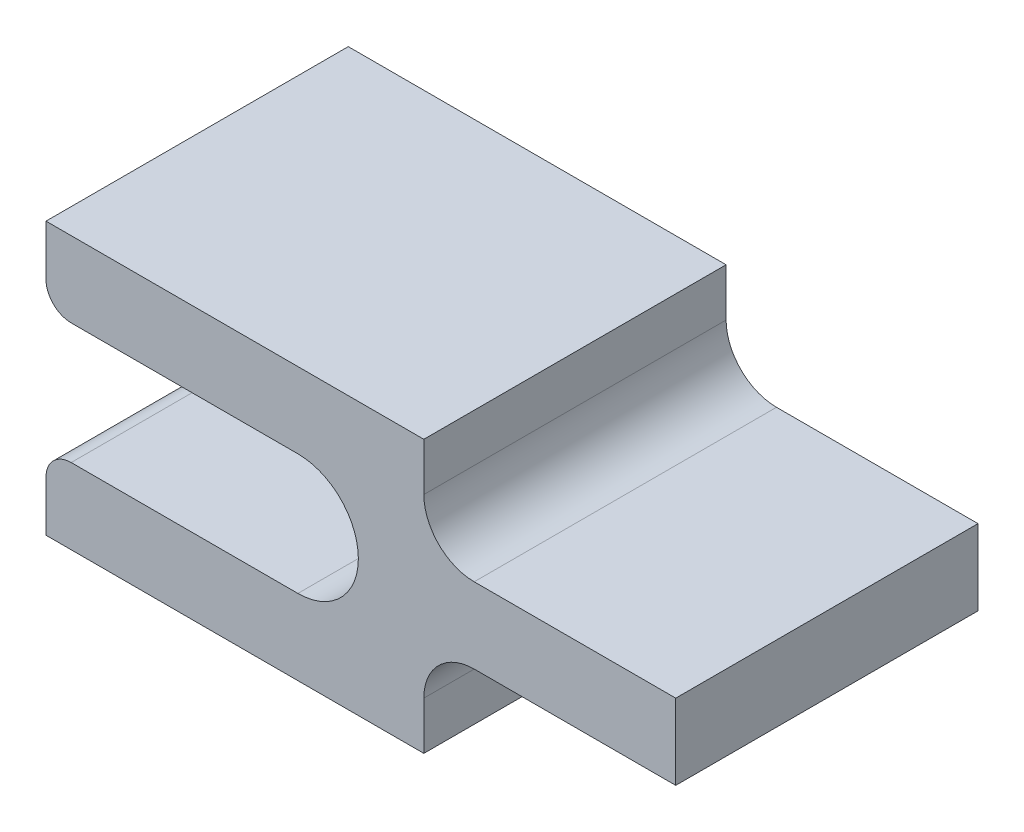
ISO-10303-21;
HEADER;
FILE_DESCRIPTION(('STEP AP214'),'2;1');
FILE_NAME('part.step','',(''),(''),'','','');
FILE_SCHEMA(('AUTOMOTIVE_DESIGN { 1 0 10303 214 1 1 1 1 }'));
ENDSEC;
DATA;
#1=APPLICATION_CONTEXT('core data for automotive mechanical design processes');
#2=APPLICATION_PROTOCOL_DEFINITION('international standard','automotive_design',2000,#1);
#3=PRODUCT_CONTEXT('',#1,'mechanical');
#4=PRODUCT('Part','Part','',(#3));
#5=PRODUCT_RELATED_PRODUCT_CATEGORY('part','',(#4));
#6=PRODUCT_DEFINITION_FORMATION('','',#4);
#7=PRODUCT_DEFINITION_CONTEXT('part definition',#1,'design');
#8=PRODUCT_DEFINITION('design','',#6,#7);
#9=PRODUCT_DEFINITION_SHAPE('','',#8);
#10=(LENGTH_UNIT() NAMED_UNIT(*) SI_UNIT(.MILLI.,.METRE.));
#11=(NAMED_UNIT(*) PLANE_ANGLE_UNIT() SI_UNIT($,.RADIAN.));
#12=(NAMED_UNIT(*) SI_UNIT($,.STERADIAN.) SOLID_ANGLE_UNIT());
#13=UNCERTAINTY_MEASURE_WITH_UNIT(LENGTH_MEASURE(1.E-05),#10,'distance_accuracy_value','');
#14=(GEOMETRIC_REPRESENTATION_CONTEXT(3) GLOBAL_UNCERTAINTY_ASSIGNED_CONTEXT((#13)) GLOBAL_UNIT_ASSIGNED_CONTEXT((#10,
#11,#12)) REPRESENTATION_CONTEXT('',''));
#15=CARTESIAN_POINT('',(0.,0.,0.));
#16=DIRECTION('',(0.,0.,1.));
#17=DIRECTION('',(1.,0.,0.));
#18=AXIS2_PLACEMENT_3D('',#15,#16,#17);
#19=CARTESIAN_POINT('',(5.,0.,-2.));
#20=DIRECTION('',(-1.,0.,0.));
#21=DIRECTION('',(0.,0.,1.));
#22=AXIS2_PLACEMENT_3D('',#19,#20,#21);
#23=PLANE('',#22);
#24=DIRECTION('',(0.,-1.,0.));
#25=VECTOR('',#24,1.);
#26=CARTESIAN_POINT('',(5.,0.,10.));
#27=LINE('',#26,#25);
#28=CARTESIAN_POINT('',(5.,5.4,10.));
#29=VERTEX_POINT('',#28);
#30=CARTESIAN_POINT('',(5.,3.5,10.));
#31=VERTEX_POINT('',#30);
#32=EDGE_CURVE('E269',#29,#31,#27,.T.);
#33=ORIENTED_EDGE('',*,*,#32,.T.);
#34=DIRECTION('',(0.,0.,1.));
#35=VECTOR('',#34,1.);
#36=CARTESIAN_POINT('',(5.,3.5,-2.));
#37=LINE('',#36,#35);
#38=CARTESIAN_POINT('',(5.,3.5,-2.));
#39=VERTEX_POINT('',#38);
#40=EDGE_CURVE('E56',#31,#39,#37,.F.);
#41=ORIENTED_EDGE('',*,*,#40,.T.);
#42=DIRECTION('',(0.,-1.,0.));
#43=VECTOR('',#42,1.);
#44=CARTESIAN_POINT('',(5.,0.,-2.));
#45=LINE('',#44,#43);
#46=CARTESIAN_POINT('',(5.,5.4,-2.));
#47=VERTEX_POINT('',#46);
#48=EDGE_CURVE('E274',#47,#39,#45,.T.);
#49=ORIENTED_EDGE('',*,*,#48,.F.);
#50=DIRECTION('',(0.,0.,1.));
#51=VECTOR('',#50,1.);
#52=CARTESIAN_POINT('',(5.,5.4,-2.));
#53=LINE('',#52,#51);
#54=EDGE_CURVE('E383',#47,#29,#53,.T.);
#55=ORIENTED_EDGE('',*,*,#54,.T.);
#56=EDGE_LOOP('',(#33,#41,#49,#55));
#57=FACE_BOUND('',#56,.T.);
#58=ADVANCED_FACE('F35',(#57),#23,.F.);
#59=CARTESIAN_POINT('',(0.,2.4,-2.));
#60=DIRECTION('',(0.,1.,0.));
#61=DIRECTION('',(0.,0.,1.));
#62=AXIS2_PLACEMENT_3D('',#59,#60,#61);
#63=PLANE('',#62);
#64=DIRECTION('',(-1.,0.,0.));
#65=VECTOR('',#64,1.);
#66=CARTESIAN_POINT('',(0.,2.4,10.));
#67=LINE('',#66,#65);
#68=CARTESIAN_POINT('',(0.,2.4,10.));
#69=VERTEX_POINT('',#68);
#70=CARTESIAN_POINT('',(-9.,2.4,10.));
#71=VERTEX_POINT('',#70);
#72=EDGE_CURVE('E245',#69,#71,#67,.T.);
#73=ORIENTED_EDGE('',*,*,#72,.T.);
#74=DIRECTION('',(0.,0.,1.));
#75=VECTOR('',#74,1.);
#76=CARTESIAN_POINT('',(-9.,2.4,-2.));
#77=LINE('',#76,#75);
#78=CARTESIAN_POINT('',(-9.,2.4,0.));
#79=VERTEX_POINT('',#78);
#80=EDGE_CURVE('E361',#71,#79,#77,.F.);
#81=ORIENTED_EDGE('',*,*,#80,.T.);
#82=DIRECTION('',(1.,0.,0.));
#83=VECTOR('',#82,1.);
#84=CARTESIAN_POINT('',(0.,2.4,0.));
#85=LINE('',#84,#83);
#86=CARTESIAN_POINT('',(0.,2.4,0.));
#87=VERTEX_POINT('',#86);
#88=EDGE_CURVE('E243',#79,#87,#85,.T.);
#89=ORIENTED_EDGE('',*,*,#88,.T.);
#90=DIRECTION('',(0.,0.,1.));
#91=VECTOR('',#90,1.);
#92=CARTESIAN_POINT('',(0.,2.4,-2.));
#93=LINE('',#92,#91);
#94=EDGE_CURVE('E374',#87,#69,#93,.T.);
#95=ORIENTED_EDGE('',*,*,#94,.T.);
#96=EDGE_LOOP('',(#73,#81,#89,#95));
#97=FACE_BOUND('',#96,.T.);
#98=ADVANCED_FACE('F395',(#97),#63,.F.);
#99=CARTESIAN_POINT('',(-10.,0.,-2.));
#100=DIRECTION('',(1.,0.,0.));
#101=DIRECTION('',(0.,0.,-1.));
#102=AXIS2_PLACEMENT_3D('',#99,#100,#101);
#103=PLANE('',#102);
#104=DIRECTION('',(0.,1.,0.));
#105=VECTOR('',#104,1.);
#106=CARTESIAN_POINT('',(-10.,0.,-2.));
#107=LINE('',#106,#105);
#108=CARTESIAN_POINT('',(-10.,2.6,-2.));
#109=VERTEX_POINT('',#108);
#110=CARTESIAN_POINT('',(-10.,5.4,-2.));
#111=VERTEX_POINT('',#110);
#112=EDGE_CURVE('E377',#109,#111,#107,.T.);
#113=ORIENTED_EDGE('',*,*,#112,.F.);
#114=DIRECTION('',(0.,0.,1.));
#115=VECTOR('',#114,1.);
#116=CARTESIAN_POINT('',(-10.,2.6,-2.));
#117=LINE('',#116,#115);
#118=CARTESIAN_POINT('',(-10.,2.6,0.));
#119=VERTEX_POINT('',#118);
#120=EDGE_CURVE('E347',#109,#119,#117,.T.);
#121=ORIENTED_EDGE('',*,*,#120,.T.);
#122=DIRECTION('',(0.,1.,0.));
#123=VECTOR('',#122,1.);
#124=CARTESIAN_POINT('',(-10.,0.,0.));
#125=LINE('',#124,#123);
#126=CARTESIAN_POINT('',(-10.,3.4,0.));
#127=VERTEX_POINT('',#126);
#128=EDGE_CURVE('E227',#119,#127,#125,.T.);
#129=ORIENTED_EDGE('',*,*,#128,.T.);
#130=DIRECTION('',(0.,0.,1.));
#131=VECTOR('',#130,1.);
#132=CARTESIAN_POINT('',(-10.,3.4,-2.));
#133=LINE('',#132,#131);
#134=CARTESIAN_POINT('',(-10.,3.4,10.));
#135=VERTEX_POINT('',#134);
#136=EDGE_CURVE('E367',#127,#135,#133,.T.);
#137=ORIENTED_EDGE('',*,*,#136,.T.);
#138=DIRECTION('',(0.,1.,0.));
#139=VECTOR('',#138,1.);
#140=CARTESIAN_POINT('',(-10.,0.,10.));
#141=LINE('',#140,#139);
#142=CARTESIAN_POINT('',(-10.,5.4,10.));
#143=VERTEX_POINT('',#142);
#144=EDGE_CURVE('E615',#135,#143,#141,.T.);
#145=ORIENTED_EDGE('',*,*,#144,.T.);
#146=DIRECTION('',(0.,0.,1.));
#147=VECTOR('',#146,1.);
#148=CARTESIAN_POINT('',(-10.,5.4,-2.));
#149=LINE('',#148,#147);
#150=EDGE_CURVE('E373',#111,#143,#149,.T.);
#151=ORIENTED_EDGE('',*,*,#150,.F.);
#152=EDGE_LOOP('',(#113,#121,#129,#137,#145,#151));
#153=FACE_BOUND('',#152,.T.);
#154=ADVANCED_FACE('F400',(#153),#103,.F.);
#155=CARTESIAN_POINT('',(0.,5.4,-2.));
#156=DIRECTION('',(0.,-1.,0.));
#157=DIRECTION('',(0.,0.,-1.));
#158=AXIS2_PLACEMENT_3D('',#155,#156,#157);
#159=PLANE('',#158);
#160=DIRECTION('',(1.,0.,0.));
#161=VECTOR('',#160,1.);
#162=CARTESIAN_POINT('',(0.,5.4,10.));
#163=LINE('',#162,#161);
#164=EDGE_CURVE('E262',#143,#29,#163,.T.);
#165=ORIENTED_EDGE('',*,*,#164,.T.);
#166=ORIENTED_EDGE('',*,*,#54,.F.);
#167=DIRECTION('',(1.,0.,0.));
#168=VECTOR('',#167,1.);
#169=CARTESIAN_POINT('',(0.,5.4,-2.));
#170=LINE('',#169,#168);
#171=EDGE_CURVE('E276',#111,#47,#170,.T.);
#172=ORIENTED_EDGE('',*,*,#171,.F.);
#173=ORIENTED_EDGE('',*,*,#150,.T.);
#174=EDGE_LOOP('',(#165,#166,#172,#173));
#175=FACE_BOUND('',#174,.T.);
#176=ADVANCED_FACE('F392',(#175),#159,.F.);
#177=CARTESIAN_POINT('',(5.,-3.5,-2.));
#178=VERTEX_POINT('',#177);
#179=CARTESIAN_POINT('',(5.,-5.4,-2.));
#180=VERTEX_POINT('',#179);
#181=EDGE_CURVE('E277',#178,#180,#45,.T.);
#182=ORIENTED_EDGE('',*,*,#181,.F.);
#183=DIRECTION('',(0.,0.,1.));
#184=VECTOR('',#183,1.);
#185=CARTESIAN_POINT('',(5.,-3.5,10.));
#186=LINE('',#185,#184);
#187=CARTESIAN_POINT('',(5.,-3.5,10.));
#188=VERTEX_POINT('',#187);
#189=EDGE_CURVE('E308',#178,#188,#186,.T.);
#190=ORIENTED_EDGE('',*,*,#189,.T.);
#191=CARTESIAN_POINT('',(5.,-5.4,10.));
#192=VERTEX_POINT('',#191);
#193=EDGE_CURVE('E259',#188,#192,#27,.T.);
#194=ORIENTED_EDGE('',*,*,#193,.T.);
#195=DIRECTION('',(0.,0.,1.));
#196=VECTOR('',#195,1.);
#197=CARTESIAN_POINT('',(5.,-5.4,-2.));
#198=LINE('',#197,#196);
#199=EDGE_CURVE('E323',#180,#192,#198,.T.);
#200=ORIENTED_EDGE('',*,*,#199,.F.);
#201=EDGE_LOOP('',(#182,#190,#194,#200));
#202=FACE_BOUND('',#201,.T.);
#203=ADVANCED_FACE('F321',(#202),#23,.F.);
#204=CARTESIAN_POINT('',(0.,-5.4,-2.));
#205=DIRECTION('',(0.,1.,0.));
#206=DIRECTION('',(0.,0.,1.));
#207=AXIS2_PLACEMENT_3D('',#204,#205,#206);
#208=PLANE('',#207);
#209=DIRECTION('',(-1.,0.,0.));
#210=VECTOR('',#209,1.);
#211=CARTESIAN_POINT('',(0.,-5.4,10.));
#212=LINE('',#211,#210);
#213=CARTESIAN_POINT('',(-10.,-5.4,10.));
#214=VERTEX_POINT('',#213);
#215=EDGE_CURVE('E256',#192,#214,#212,.T.);
#216=ORIENTED_EDGE('',*,*,#215,.T.);
#217=DIRECTION('',(0.,0.,1.));
#218=VECTOR('',#217,1.);
#219=CARTESIAN_POINT('',(-10.,-5.4,-2.));
#220=LINE('',#219,#218);
#221=CARTESIAN_POINT('',(-10.,-5.4,-2.));
#222=VERTEX_POINT('',#221);
#223=EDGE_CURVE('E380',#222,#214,#220,.T.);
#224=ORIENTED_EDGE('',*,*,#223,.F.);
#225=DIRECTION('',(-1.,0.,0.));
#226=VECTOR('',#225,1.);
#227=CARTESIAN_POINT('',(0.,-5.4,-2.));
#228=LINE('',#227,#226);
#229=EDGE_CURVE('E282',#180,#222,#228,.T.);
#230=ORIENTED_EDGE('',*,*,#229,.F.);
#231=ORIENTED_EDGE('',*,*,#199,.T.);
#232=EDGE_LOOP('',(#216,#224,#230,#231));
#233=FACE_BOUND('',#232,.T.);
#234=ADVANCED_FACE('F406',(#233),#208,.F.);
#235=CARTESIAN_POINT('',(-10.,0.,-2.));
#236=DIRECTION('',(1.,0.,0.));
#237=DIRECTION('',(0.,0.,-1.));
#238=AXIS2_PLACEMENT_3D('',#235,#236,#237);
#239=PLANE('',#238);
#240=DIRECTION('',(0.,-1.,0.));
#241=VECTOR('',#240,1.);
#242=CARTESIAN_POINT('',(-10.,0.,0.));
#243=LINE('',#242,#241);
#244=CARTESIAN_POINT('',(-10.,-2.6,0.));
#245=VERTEX_POINT('',#244);
#246=CARTESIAN_POINT('',(-10.,-3.4,0.));
#247=VERTEX_POINT('',#246);
#248=EDGE_CURVE('E213',#245,#247,#243,.T.);
#249=ORIENTED_EDGE('',*,*,#248,.F.);
#250=DIRECTION('',(0.,0.,1.));
#251=VECTOR('',#250,1.);
#252=CARTESIAN_POINT('',(-10.,-2.6,-2.));
#253=LINE('',#252,#251);
#254=CARTESIAN_POINT('',(-10.,-2.6,-2.));
#255=VERTEX_POINT('',#254);
#256=EDGE_CURVE('E272',#245,#255,#253,.F.);
#257=ORIENTED_EDGE('',*,*,#256,.T.);
#258=DIRECTION('',(0.,1.,0.));
#259=VECTOR('',#258,1.);
#260=CARTESIAN_POINT('',(-10.,0.,-2.));
#261=LINE('',#260,#259);
#262=EDGE_CURVE('E603',#222,#255,#261,.T.);
#263=ORIENTED_EDGE('',*,*,#262,.F.);
#264=ORIENTED_EDGE('',*,*,#223,.T.);
#265=DIRECTION('',(0.,1.,0.));
#266=VECTOR('',#265,1.);
#267=CARTESIAN_POINT('',(-10.,0.,10.));
#268=LINE('',#267,#266);
#269=CARTESIAN_POINT('',(-10.,-3.4,10.));
#270=VERTEX_POINT('',#269);
#271=EDGE_CURVE('E253',#214,#270,#268,.T.);
#272=ORIENTED_EDGE('',*,*,#271,.T.);
#273=DIRECTION('',(0.,0.,1.));
#274=VECTOR('',#273,1.);
#275=CARTESIAN_POINT('',(-10.,-3.4,-2.));
#276=LINE('',#275,#274);
#277=EDGE_CURVE('E355',#270,#247,#276,.F.);
#278=ORIENTED_EDGE('',*,*,#277,.T.);
#279=EDGE_LOOP('',(#249,#257,#263,#264,#272,#278));
#280=FACE_BOUND('',#279,.T.);
#281=ADVANCED_FACE('F411',(#280),#239,.F.);
#282=CARTESIAN_POINT('',(0.,-2.4,-2.));
#283=DIRECTION('',(0.,-1.,0.));
#284=DIRECTION('',(0.,0.,-1.));
#285=AXIS2_PLACEMENT_3D('',#282,#283,#284);
#286=PLANE('',#285);
#287=DIRECTION('',(-1.,0.,0.));
#288=VECTOR('',#287,1.);
#289=CARTESIAN_POINT('',(0.,-2.4,0.));
#290=LINE('',#289,#288);
#291=CARTESIAN_POINT('',(0.,-2.4,0.));
#292=VERTEX_POINT('',#291);
#293=CARTESIAN_POINT('',(-9.,-2.4,0.));
#294=VERTEX_POINT('',#293);
#295=EDGE_CURVE('E239',#292,#294,#290,.T.);
#296=ORIENTED_EDGE('',*,*,#295,.T.);
#297=DIRECTION('',(0.,0.,1.));
#298=VECTOR('',#297,1.);
#299=CARTESIAN_POINT('',(-9.,-2.4,-2.));
#300=LINE('',#299,#298);
#301=CARTESIAN_POINT('',(-9.,-2.4,10.));
#302=VERTEX_POINT('',#301);
#303=EDGE_CURVE('E358',#294,#302,#300,.T.);
#304=ORIENTED_EDGE('',*,*,#303,.T.);
#305=DIRECTION('',(1.,0.,0.));
#306=VECTOR('',#305,1.);
#307=CARTESIAN_POINT('',(0.,-2.4,10.));
#308=LINE('',#307,#306);
#309=CARTESIAN_POINT('',(0.,-2.4,10.));
#310=VERTEX_POINT('',#309);
#311=EDGE_CURVE('E251',#302,#310,#308,.T.);
#312=ORIENTED_EDGE('',*,*,#311,.T.);
#313=DIRECTION('',(0.,0.,1.));
#314=VECTOR('',#313,1.);
#315=CARTESIAN_POINT('',(0.,-2.4,-2.));
#316=LINE('',#315,#314);
#317=EDGE_CURVE('E376',#292,#310,#316,.T.);
#318=ORIENTED_EDGE('',*,*,#317,.F.);
#319=EDGE_LOOP('',(#296,#304,#312,#318));
#320=FACE_BOUND('',#319,.T.);
#321=ADVANCED_FACE('F592',(#320),#286,.F.);
#322=CARTESIAN_POINT('',(0.,0.,-2.));
#323=DIRECTION('',(0.,0.,1.));
#324=DIRECTION('',(1.,0.,0.));
#325=AXIS2_PLACEMENT_3D('',#322,#323,#324);
#326=CYLINDRICAL_SURFACE('',#325,2.4);
#327=CARTESIAN_POINT('',(0.,0.,0.));
#328=DIRECTION('',(0.,0.,1.));
#329=DIRECTION('',(1.,0.,0.));
#330=AXIS2_PLACEMENT_3D('',#327,#328,#329);
#331=CIRCLE('',#330,2.4);
#332=EDGE_CURVE('E370',#292,#87,#331,.T.);
#333=ORIENTED_EDGE('',*,*,#332,.F.);
#334=ORIENTED_EDGE('',*,*,#317,.T.);
#335=CARTESIAN_POINT('',(0.,0.,10.));
#336=DIRECTION('',(0.,0.,1.));
#337=DIRECTION('',(1.,0.,0.));
#338=AXIS2_PLACEMENT_3D('',#335,#336,#337);
#339=CIRCLE('',#338,2.4);
#340=EDGE_CURVE('E248',#69,#310,#339,.F.);
#341=ORIENTED_EDGE('',*,*,#340,.F.);
#342=ORIENTED_EDGE('',*,*,#94,.F.);
#343=EDGE_LOOP('',(#333,#334,#341,#342));
#344=FACE_BOUND('',#343,.T.);
#345=ADVANCED_FACE('F421',(#344),#326,.F.);
#346=CARTESIAN_POINT('',(0.,0.,-2.));
#347=DIRECTION('',(0.,0.,1.));
#348=DIRECTION('',(1.,0.,0.));
#349=AXIS2_PLACEMENT_3D('',#346,#347,#348);
#350=PLANE('',#349);
#351=DIRECTION('',(-1.,0.,0.));
#352=VECTOR('',#351,1.);
#353=CARTESIAN_POINT('',(0.,1.6,-2.));
#354=LINE('',#353,#352);
#355=CARTESIAN_POINT('',(0.,1.6,-2.));
#356=VERTEX_POINT('',#355);
#357=CARTESIAN_POINT('',(-9.,1.6,-2.));
#358=VERTEX_POINT('',#357);
#359=EDGE_CURVE('E215',#356,#358,#354,.T.);
#360=ORIENTED_EDGE('',*,*,#359,.T.);
#361=CARTESIAN_POINT('',(-9.,2.6,-2.));
#362=DIRECTION('',(0.,0.,1.));
#363=DIRECTION('',(1.,0.,0.));
#364=AXIS2_PLACEMENT_3D('',#361,#362,#363);
#365=CIRCLE('',#364,1.);
#366=EDGE_CURVE('E333',#358,#109,#365,.F.);
#367=ORIENTED_EDGE('',*,*,#366,.T.);
#368=ORIENTED_EDGE('',*,*,#112,.T.);
#369=ORIENTED_EDGE('',*,*,#171,.T.);
#370=ORIENTED_EDGE('',*,*,#48,.T.);
#371=CARTESIAN_POINT('',(7.,3.5,-2.));
#372=DIRECTION('',(0.,0.,1.));
#373=DIRECTION('',(1.,0.,0.));
#374=AXIS2_PLACEMENT_3D('',#371,#372,#373);
#375=CIRCLE('',#374,2.);
#376=CARTESIAN_POINT('',(7.,1.5,-2.));
#377=VERTEX_POINT('',#376);
#378=EDGE_CURVE('E11',#39,#377,#375,.T.);
#379=ORIENTED_EDGE('',*,*,#378,.T.);
#380=DIRECTION('',(-1.,0.,0.));
#381=VECTOR('',#380,1.);
#382=CARTESIAN_POINT('',(0.,1.5,-2.));
#383=LINE('',#382,#381);
#384=CARTESIAN_POINT('',(15.,1.5,-2.));
#385=VERTEX_POINT('',#384);
#386=EDGE_CURVE('E196',#385,#377,#383,.T.);
#387=ORIENTED_EDGE('',*,*,#386,.F.);
#388=DIRECTION('',(0.,-1.,0.));
#389=VECTOR('',#388,1.);
#390=CARTESIAN_POINT('',(15.,0.,-2.));
#391=LINE('',#390,#389);
#392=CARTESIAN_POINT('',(15.,-1.5,-2.));
#393=VERTEX_POINT('',#392);
#394=EDGE_CURVE('E211',#385,#393,#391,.T.);
#395=ORIENTED_EDGE('',*,*,#394,.T.);
#396=DIRECTION('',(-1.,0.,0.));
#397=VECTOR('',#396,1.);
#398=CARTESIAN_POINT('',(0.,-1.5,-2.));
#399=LINE('',#398,#397);
#400=CARTESIAN_POINT('',(7.,-1.5,-2.));
#401=VERTEX_POINT('',#400);
#402=EDGE_CURVE('E191',#393,#401,#399,.T.);
#403=ORIENTED_EDGE('',*,*,#402,.T.);
#404=CARTESIAN_POINT('',(7.,-3.5,-2.));
#405=DIRECTION('',(0.,0.,1.));
#406=DIRECTION('',(1.,0.,0.));
#407=AXIS2_PLACEMENT_3D('',#404,#405,#406);
#408=CIRCLE('',#407,2.);
#409=EDGE_CURVE('E312',#401,#178,#408,.T.);
#410=ORIENTED_EDGE('',*,*,#409,.T.);
#411=ORIENTED_EDGE('',*,*,#181,.T.);
#412=ORIENTED_EDGE('',*,*,#229,.T.);
#413=ORIENTED_EDGE('',*,*,#262,.T.);
#414=CARTESIAN_POINT('',(-9.,-2.6,-2.));
#415=DIRECTION('',(0.,0.,1.));
#416=DIRECTION('',(1.,0.,0.));
#417=AXIS2_PLACEMENT_3D('',#414,#415,#416);
#418=CIRCLE('',#417,1.);
#419=CARTESIAN_POINT('',(-9.,-1.6,-2.));
#420=VERTEX_POINT('',#419);
#421=EDGE_CURVE('E337',#255,#420,#418,.F.);
#422=ORIENTED_EDGE('',*,*,#421,.T.);
#423=DIRECTION('',(-1.,0.,0.));
#424=VECTOR('',#423,1.);
#425=CARTESIAN_POINT('',(0.,-1.6,-2.));
#426=LINE('',#425,#424);
#427=CARTESIAN_POINT('',(0.,-1.6,-2.));
#428=VERTEX_POINT('',#427);
#429=EDGE_CURVE('E222',#428,#420,#426,.T.);
#430=ORIENTED_EDGE('',*,*,#429,.F.);
#431=CARTESIAN_POINT('',(0.,0.,-2.));
#432=DIRECTION('',(0.,0.,1.));
#433=DIRECTION('',(1.,0.,0.));
#434=AXIS2_PLACEMENT_3D('',#431,#432,#433);
#435=CIRCLE('',#434,1.6);
#436=EDGE_CURVE('E218',#356,#428,#435,.F.);
#437=ORIENTED_EDGE('',*,*,#436,.F.);
#438=EDGE_LOOP('',(#360,#367,#368,#369,#370,#379,#387,#395,#403,#410,#411,#412,#413,#422,#430,#437));
#439=FACE_BOUND('',#438,.T.);
#440=ADVANCED_FACE('F315',(#439),#350,.F.);
#441=CARTESIAN_POINT('',(0.,0.,10.));
#442=DIRECTION('',(0.,0.,1.));
#443=DIRECTION('',(1.,0.,0.));
#444=AXIS2_PLACEMENT_3D('',#441,#442,#443);
#445=PLANE('',#444);
#446=ORIENTED_EDGE('',*,*,#144,.F.);
#447=CARTESIAN_POINT('',(-9.,3.4,10.));
#448=DIRECTION('',(0.,0.,1.));
#449=DIRECTION('',(1.,0.,0.));
#450=AXIS2_PLACEMENT_3D('',#447,#448,#449);
#451=CIRCLE('',#450,1.);
#452=EDGE_CURVE('E363',#135,#71,#451,.T.);
#453=ORIENTED_EDGE('',*,*,#452,.T.);
#454=ORIENTED_EDGE('',*,*,#72,.F.);
#455=ORIENTED_EDGE('',*,*,#340,.T.);
#456=ORIENTED_EDGE('',*,*,#311,.F.);
#457=CARTESIAN_POINT('',(-9.,-3.4,10.));
#458=DIRECTION('',(0.,0.,1.));
#459=DIRECTION('',(1.,0.,0.));
#460=AXIS2_PLACEMENT_3D('',#457,#458,#459);
#461=CIRCLE('',#460,1.);
#462=EDGE_CURVE('E365',#302,#270,#461,.T.);
#463=ORIENTED_EDGE('',*,*,#462,.T.);
#464=ORIENTED_EDGE('',*,*,#271,.F.);
#465=ORIENTED_EDGE('',*,*,#215,.F.);
#466=ORIENTED_EDGE('',*,*,#193,.F.);
#467=CARTESIAN_POINT('',(7.,-3.5,10.));
#468=DIRECTION('',(0.,0.,1.));
#469=DIRECTION('',(1.,0.,0.));
#470=AXIS2_PLACEMENT_3D('',#467,#468,#469);
#471=CIRCLE('',#470,2.);
#472=CARTESIAN_POINT('',(7.,-1.5,10.));
#473=VERTEX_POINT('',#472);
#474=EDGE_CURVE('E203',#188,#473,#471,.F.);
#475=ORIENTED_EDGE('',*,*,#474,.T.);
#476=DIRECTION('',(-1.,0.,0.));
#477=VECTOR('',#476,1.);
#478=CARTESIAN_POINT('',(0.,-1.5,10.));
#479=LINE('',#478,#477);
#480=CARTESIAN_POINT('',(15.,-1.5,10.));
#481=VERTEX_POINT('',#480);
#482=EDGE_CURVE('E188',#481,#473,#479,.T.);
#483=ORIENTED_EDGE('',*,*,#482,.F.);
#484=DIRECTION('',(0.,-1.,0.));
#485=VECTOR('',#484,1.);
#486=CARTESIAN_POINT('',(15.,0.,10.));
#487=LINE('',#486,#485);
#488=CARTESIAN_POINT('',(15.,1.5,10.));
#489=VERTEX_POINT('',#488);
#490=EDGE_CURVE('E201',#489,#481,#487,.T.);
#491=ORIENTED_EDGE('',*,*,#490,.F.);
#492=DIRECTION('',(-1.,0.,0.));
#493=VECTOR('',#492,1.);
#494=CARTESIAN_POINT('',(0.,1.5,10.));
#495=LINE('',#494,#493);
#496=CARTESIAN_POINT('',(7.,1.5,10.));
#497=VERTEX_POINT('',#496);
#498=EDGE_CURVE('E207',#489,#497,#495,.T.);
#499=ORIENTED_EDGE('',*,*,#498,.T.);
#500=CARTESIAN_POINT('',(7.,3.5,10.));
#501=DIRECTION('',(0.,0.,1.));
#502=DIRECTION('',(1.,0.,0.));
#503=AXIS2_PLACEMENT_3D('',#500,#501,#502);
#504=CIRCLE('',#503,2.);
#505=EDGE_CURVE('E43',#497,#31,#504,.F.);
#506=ORIENTED_EDGE('',*,*,#505,.T.);
#507=ORIENTED_EDGE('',*,*,#32,.F.);
#508=ORIENTED_EDGE('',*,*,#164,.F.);
#509=EDGE_LOOP('',(#446,#453,#454,#455,#456,#463,#464,#465,#466,#475,#483,#491,#499,#506,#507,#508));
#510=FACE_BOUND('',#509,.T.);
#511=ADVANCED_FACE('F200',(#510),#445,.T.);
#512=CARTESIAN_POINT('',(0.,0.,0.));
#513=DIRECTION('',(0.,0.,1.));
#514=DIRECTION('',(1.,0.,0.));
#515=AXIS2_PLACEMENT_3D('',#512,#513,#514);
#516=PLANE('',#515);
#517=ORIENTED_EDGE('',*,*,#128,.F.);
#518=CARTESIAN_POINT('',(-9.,2.6,0.));
#519=DIRECTION('',(0.,0.,1.));
#520=DIRECTION('',(1.,0.,0.));
#521=AXIS2_PLACEMENT_3D('',#518,#519,#520);
#522=CIRCLE('',#521,1.);
#523=CARTESIAN_POINT('',(-9.,1.6,0.));
#524=VERTEX_POINT('',#523);
#525=EDGE_CURVE('E343',#119,#524,#522,.T.);
#526=ORIENTED_EDGE('',*,*,#525,.T.);
#527=DIRECTION('',(-1.,0.,0.));
#528=VECTOR('',#527,1.);
#529=CARTESIAN_POINT('',(0.,1.6,0.));
#530=LINE('',#529,#528);
#531=CARTESIAN_POINT('',(0.,1.6,0.));
#532=VERTEX_POINT('',#531);
#533=EDGE_CURVE('E229',#532,#524,#530,.T.);
#534=ORIENTED_EDGE('',*,*,#533,.F.);
#535=CARTESIAN_POINT('',(0.,0.,0.));
#536=DIRECTION('',(0.,0.,1.));
#537=DIRECTION('',(1.,0.,0.));
#538=AXIS2_PLACEMENT_3D('',#535,#536,#537);
#539=CIRCLE('',#538,1.6);
#540=CARTESIAN_POINT('',(0.,-1.6,0.));
#541=VERTEX_POINT('',#540);
#542=EDGE_CURVE('E232',#532,#541,#539,.F.);
#543=ORIENTED_EDGE('',*,*,#542,.T.);
#544=DIRECTION('',(-1.,0.,0.));
#545=VECTOR('',#544,1.);
#546=CARTESIAN_POINT('',(0.,-1.6,0.));
#547=LINE('',#546,#545);
#548=CARTESIAN_POINT('',(-9.,-1.6,0.));
#549=VERTEX_POINT('',#548);
#550=EDGE_CURVE('E219',#541,#549,#547,.T.);
#551=ORIENTED_EDGE('',*,*,#550,.T.);
#552=CARTESIAN_POINT('',(-9.,-2.6,0.));
#553=DIRECTION('',(0.,0.,1.));
#554=DIRECTION('',(1.,0.,0.));
#555=AXIS2_PLACEMENT_3D('',#552,#553,#554);
#556=CIRCLE('',#555,1.);
#557=EDGE_CURVE('E345',#549,#245,#556,.T.);
#558=ORIENTED_EDGE('',*,*,#557,.T.);
#559=ORIENTED_EDGE('',*,*,#248,.T.);
#560=CARTESIAN_POINT('',(-9.,-3.4,0.));
#561=DIRECTION('',(0.,0.,1.));
#562=DIRECTION('',(1.,0.,0.));
#563=AXIS2_PLACEMENT_3D('',#560,#561,#562);
#564=CIRCLE('',#563,1.);
#565=EDGE_CURVE('E350',#247,#294,#564,.F.);
#566=ORIENTED_EDGE('',*,*,#565,.T.);
#567=ORIENTED_EDGE('',*,*,#295,.F.);
#568=ORIENTED_EDGE('',*,*,#332,.T.);
#569=ORIENTED_EDGE('',*,*,#88,.F.);
#570=CARTESIAN_POINT('',(-9.,3.4,0.));
#571=DIRECTION('',(0.,0.,1.));
#572=DIRECTION('',(1.,0.,0.));
#573=AXIS2_PLACEMENT_3D('',#570,#571,#572);
#574=CIRCLE('',#573,1.);
#575=EDGE_CURVE('E352',#79,#127,#574,.F.);
#576=ORIENTED_EDGE('',*,*,#575,.T.);
#577=EDGE_LOOP('',(#517,#526,#534,#543,#551,#558,#559,#566,#567,#568,#569,#576));
#578=FACE_BOUND('',#577,.T.);
#579=ADVANCED_FACE('F424',(#578),#516,.T.);
#580=CARTESIAN_POINT('',(0.,-1.6,-2.));
#581=DIRECTION('',(0.,1.,0.));
#582=DIRECTION('',(-1.,0.,0.));
#583=AXIS2_PLACEMENT_3D('',#580,#581,#582);
#584=PLANE('',#583);
#585=ORIENTED_EDGE('',*,*,#429,.T.);
#586=DIRECTION('',(0.,0.,1.));
#587=VECTOR('',#586,1.);
#588=CARTESIAN_POINT('',(-9.,-1.6,0.));
#589=LINE('',#588,#587);
#590=EDGE_CURVE('E326',#420,#549,#589,.T.);
#591=ORIENTED_EDGE('',*,*,#590,.T.);
#592=ORIENTED_EDGE('',*,*,#550,.F.);
#593=DIRECTION('',(0.,0.,1.));
#594=VECTOR('',#593,1.);
#595=CARTESIAN_POINT('',(0.,-1.6,-2.));
#596=LINE('',#595,#594);
#597=EDGE_CURVE('E237',#428,#541,#596,.T.);
#598=ORIENTED_EDGE('',*,*,#597,.F.);
#599=EDGE_LOOP('',(#585,#591,#592,#598));
#600=FACE_BOUND('',#599,.T.);
#601=ADVANCED_FACE('F433',(#600),#584,.T.);
#602=CARTESIAN_POINT('',(0.,0.,-2.));
#603=DIRECTION('',(0.,0.,1.));
#604=DIRECTION('',(1.,0.,0.));
#605=AXIS2_PLACEMENT_3D('',#602,#603,#604);
#606=CYLINDRICAL_SURFACE('',#605,1.6);
#607=ORIENTED_EDGE('',*,*,#542,.F.);
#608=DIRECTION('',(0.,0.,1.));
#609=VECTOR('',#608,1.);
#610=CARTESIAN_POINT('',(0.,1.6,-2.));
#611=LINE('',#610,#609);
#612=EDGE_CURVE('E225',#356,#532,#611,.T.);
#613=ORIENTED_EDGE('',*,*,#612,.F.);
#614=ORIENTED_EDGE('',*,*,#436,.T.);
#615=ORIENTED_EDGE('',*,*,#597,.T.);
#616=EDGE_LOOP('',(#607,#613,#614,#615));
#617=FACE_BOUND('',#616,.T.);
#618=ADVANCED_FACE('F429',(#617),#606,.F.);
#619=CARTESIAN_POINT('',(0.,1.6,-2.));
#620=DIRECTION('',(0.,1.,0.));
#621=DIRECTION('',(-1.,0.,0.));
#622=AXIS2_PLACEMENT_3D('',#619,#620,#621);
#623=PLANE('',#622);
#624=ORIENTED_EDGE('',*,*,#533,.T.);
#625=DIRECTION('',(0.,0.,1.));
#626=VECTOR('',#625,1.);
#627=CARTESIAN_POINT('',(-9.,1.6,-2.));
#628=LINE('',#627,#626);
#629=EDGE_CURVE('E341',#524,#358,#628,.F.);
#630=ORIENTED_EDGE('',*,*,#629,.T.);
#631=ORIENTED_EDGE('',*,*,#359,.F.);
#632=ORIENTED_EDGE('',*,*,#612,.T.);
#633=EDGE_LOOP('',(#624,#630,#631,#632));
#634=FACE_BOUND('',#633,.T.);
#635=ADVANCED_FACE('F425',(#634),#623,.F.);
#636=CARTESIAN_POINT('',(-9.,3.4,-2.));
#637=DIRECTION('',(0.,0.,1.));
#638=DIRECTION('',(1.,0.,0.));
#639=AXIS2_PLACEMENT_3D('',#636,#637,#638);
#640=CYLINDRICAL_SURFACE('',#639,1.);
#641=ORIENTED_EDGE('',*,*,#575,.F.);
#642=ORIENTED_EDGE('',*,*,#80,.F.);
#643=ORIENTED_EDGE('',*,*,#452,.F.);
#644=ORIENTED_EDGE('',*,*,#136,.F.);
#645=EDGE_LOOP('',(#641,#642,#643,#644));
#646=FACE_BOUND('',#645,.T.);
#647=ADVANCED_FACE('F428',(#646),#640,.T.);
#648=CARTESIAN_POINT('',(-9.,-3.4,-2.));
#649=DIRECTION('',(0.,0.,1.));
#650=DIRECTION('',(1.,0.,0.));
#651=AXIS2_PLACEMENT_3D('',#648,#649,#650);
#652=CYLINDRICAL_SURFACE('',#651,1.);
#653=ORIENTED_EDGE('',*,*,#565,.F.);
#654=ORIENTED_EDGE('',*,*,#277,.F.);
#655=ORIENTED_EDGE('',*,*,#462,.F.);
#656=ORIENTED_EDGE('',*,*,#303,.F.);
#657=EDGE_LOOP('',(#653,#654,#655,#656));
#658=FACE_BOUND('',#657,.T.);
#659=ADVANCED_FACE('F555',(#658),#652,.T.);
#660=CARTESIAN_POINT('',(-9.,2.6,-2.));
#661=DIRECTION('',(0.,0.,1.));
#662=DIRECTION('',(1.,0.,0.));
#663=AXIS2_PLACEMENT_3D('',#660,#661,#662);
#664=CYLINDRICAL_SURFACE('',#663,1.);
#665=ORIENTED_EDGE('',*,*,#366,.F.);
#666=ORIENTED_EDGE('',*,*,#629,.F.);
#667=ORIENTED_EDGE('',*,*,#525,.F.);
#668=ORIENTED_EDGE('',*,*,#120,.F.);
#669=EDGE_LOOP('',(#665,#666,#667,#668));
#670=FACE_BOUND('',#669,.T.);
#671=ADVANCED_FACE('F565',(#670),#664,.T.);
#672=CARTESIAN_POINT('',(-9.,-2.6,-2.));
#673=DIRECTION('',(0.,0.,-1.));
#674=DIRECTION('',(-1.,0.,0.));
#675=AXIS2_PLACEMENT_3D('',#672,#673,#674);
#676=CYLINDRICAL_SURFACE('',#675,1.);
#677=ORIENTED_EDGE('',*,*,#421,.F.);
#678=ORIENTED_EDGE('',*,*,#256,.F.);
#679=ORIENTED_EDGE('',*,*,#557,.F.);
#680=ORIENTED_EDGE('',*,*,#590,.F.);
#681=EDGE_LOOP('',(#677,#678,#679,#680));
#682=FACE_BOUND('',#681,.T.);
#683=ADVANCED_FACE('F442',(#682),#676,.T.);
#684=CARTESIAN_POINT('',(0.,-1.5,-2.));
#685=DIRECTION('',(0.,1.,0.));
#686=DIRECTION('',(-1.,0.,0.));
#687=AXIS2_PLACEMENT_3D('',#684,#685,#686);
#688=PLANE('',#687);
#689=ORIENTED_EDGE('',*,*,#482,.T.);
#690=DIRECTION('',(0.,0.,1.));
#691=VECTOR('',#690,1.);
#692=CARTESIAN_POINT('',(7.,-1.5,-2.));
#693=LINE('',#692,#691);
#694=EDGE_CURVE('E305',#473,#401,#693,.F.);
#695=ORIENTED_EDGE('',*,*,#694,.T.);
#696=ORIENTED_EDGE('',*,*,#402,.F.);
#697=DIRECTION('',(0.,0.,1.));
#698=VECTOR('',#697,1.);
#699=CARTESIAN_POINT('',(15.,-1.5,-2.));
#700=LINE('',#699,#698);
#701=EDGE_CURVE('E185',#393,#481,#700,.T.);
#702=ORIENTED_EDGE('',*,*,#701,.T.);
#703=EDGE_LOOP('',(#689,#695,#696,#702));
#704=FACE_BOUND('',#703,.T.);
#705=ADVANCED_FACE('F187',(#704),#688,.F.);
#706=CARTESIAN_POINT('',(0.,1.5,-2.));
#707=DIRECTION('',(0.,1.,0.));
#708=DIRECTION('',(-1.,0.,0.));
#709=AXIS2_PLACEMENT_3D('',#706,#707,#708);
#710=PLANE('',#709);
#711=ORIENTED_EDGE('',*,*,#386,.T.);
#712=DIRECTION('',(0.,0.,1.));
#713=VECTOR('',#712,1.);
#714=CARTESIAN_POINT('',(7.,1.5,-2.));
#715=LINE('',#714,#713);
#716=EDGE_CURVE('E301',#377,#497,#715,.T.);
#717=ORIENTED_EDGE('',*,*,#716,.T.);
#718=ORIENTED_EDGE('',*,*,#498,.F.);
#719=DIRECTION('',(0.,0.,1.));
#720=VECTOR('',#719,1.);
#721=CARTESIAN_POINT('',(15.,1.5,-2.));
#722=LINE('',#721,#720);
#723=EDGE_CURVE('E195',#385,#489,#722,.T.);
#724=ORIENTED_EDGE('',*,*,#723,.F.);
#725=EDGE_LOOP('',(#711,#717,#718,#724));
#726=FACE_BOUND('',#725,.T.);
#727=ADVANCED_FACE('F300',(#726),#710,.T.);
#728=CARTESIAN_POINT('',(15.,0.,-2.));
#729=DIRECTION('',(-1.,0.,0.));
#730=DIRECTION('',(0.,0.,1.));
#731=AXIS2_PLACEMENT_3D('',#728,#729,#730);
#732=PLANE('',#731);
#733=ORIENTED_EDGE('',*,*,#723,.T.);
#734=ORIENTED_EDGE('',*,*,#490,.T.);
#735=ORIENTED_EDGE('',*,*,#701,.F.);
#736=ORIENTED_EDGE('',*,*,#394,.F.);
#737=EDGE_LOOP('',(#733,#734,#735,#736));
#738=FACE_BOUND('',#737,.T.);
#739=ADVANCED_FACE('F205',(#738),#732,.F.);
#740=CARTESIAN_POINT('',(7.,-3.5,-2.));
#741=DIRECTION('',(0.,0.,-1.));
#742=DIRECTION('',(-1.,0.,0.));
#743=AXIS2_PLACEMENT_3D('',#740,#741,#742);
#744=CYLINDRICAL_SURFACE('',#743,2.);
#745=ORIENTED_EDGE('',*,*,#409,.F.);
#746=ORIENTED_EDGE('',*,*,#694,.F.);
#747=ORIENTED_EDGE('',*,*,#474,.F.);
#748=ORIENTED_EDGE('',*,*,#189,.F.);
#749=EDGE_LOOP('',(#745,#746,#747,#748));
#750=FACE_BOUND('',#749,.T.);
#751=ADVANCED_FACE('F325',(#750),#744,.F.);
#752=CARTESIAN_POINT('',(7.,3.5,-2.));
#753=DIRECTION('',(0.,0.,1.));
#754=DIRECTION('',(1.,0.,0.));
#755=AXIS2_PLACEMENT_3D('',#752,#753,#754);
#756=CYLINDRICAL_SURFACE('',#755,2.);
#757=ORIENTED_EDGE('',*,*,#378,.F.);
#758=ORIENTED_EDGE('',*,*,#40,.F.);
#759=ORIENTED_EDGE('',*,*,#505,.F.);
#760=ORIENTED_EDGE('',*,*,#716,.F.);
#761=EDGE_LOOP('',(#757,#758,#759,#760));
#762=FACE_BOUND('',#761,.T.);
#763=ADVANCED_FACE('F37',(#762),#756,.F.);
#764=CLOSED_SHELL('',(#58,#98,#154,#176,#203,#234,#281,#321,#345,#440,#511,#579,#601,#618,#635,
#647,#659,#671,#683,#705,#727,#739,#751,#763));
#765=MANIFOLD_SOLID_BREP('B2',#764);
#766=ADVANCED_BREP_SHAPE_REPRESENTATION('',(#18,#765),#14);
#767=SHAPE_DEFINITION_REPRESENTATION(#9,#766);
ENDSEC;
END-ISO-10303-21;
